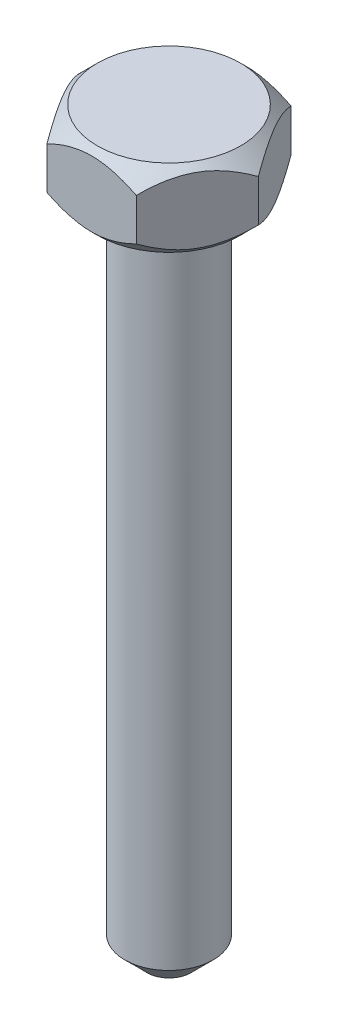
ISO-10303-21;
HEADER;
FILE_DESCRIPTION(('STEP AP214'),'2;1');
FILE_NAME('part.step','',(''),(''),'','','');
FILE_SCHEMA(('AUTOMOTIVE_DESIGN { 1 0 10303 214 1 1 1 1 }'));
ENDSEC;
DATA;
#1=APPLICATION_CONTEXT('core data for automotive mechanical design processes');
#2=APPLICATION_PROTOCOL_DEFINITION('international standard','automotive_design',2000,#1);
#3=PRODUCT_CONTEXT('',#1,'mechanical');
#4=PRODUCT('Part','Part','',(#3));
#5=PRODUCT_RELATED_PRODUCT_CATEGORY('part','',(#4));
#6=PRODUCT_DEFINITION_FORMATION('','',#4);
#7=PRODUCT_DEFINITION_CONTEXT('part definition',#1,'design');
#8=PRODUCT_DEFINITION('design','',#6,#7);
#9=PRODUCT_DEFINITION_SHAPE('','',#8);
#10=(LENGTH_UNIT() NAMED_UNIT(*) SI_UNIT(.MILLI.,.METRE.));
#11=(NAMED_UNIT(*) PLANE_ANGLE_UNIT() SI_UNIT($,.RADIAN.));
#12=(NAMED_UNIT(*) SI_UNIT($,.STERADIAN.) SOLID_ANGLE_UNIT());
#13=UNCERTAINTY_MEASURE_WITH_UNIT(LENGTH_MEASURE(1.E-05),#10,'distance_accuracy_value','');
#14=(GEOMETRIC_REPRESENTATION_CONTEXT(3) GLOBAL_UNCERTAINTY_ASSIGNED_CONTEXT((#13)) GLOBAL_UNIT_ASSIGNED_CONTEXT((#10,
#11,#12)) REPRESENTATION_CONTEXT('',''));
#15=CARTESIAN_POINT('',(0.,0.,0.));
#16=DIRECTION('',(0.,0.,1.));
#17=DIRECTION('',(1.,0.,0.));
#18=AXIS2_PLACEMENT_3D('',#15,#16,#17);
#19=CARTESIAN_POINT('',(-4.04145188432739,-3.5,0.));
#20=DIRECTION('',(0.,1.,0.));
#21=DIRECTION('',(0.,0.,1.));
#22=AXIS2_PLACEMENT_3D('',#19,#20,#21);
#23=PLANE('',#22);
#24=CARTESIAN_POINT('',(0.,-3.5,0.));
#25=DIRECTION('',(0.,1.,0.));
#26=DIRECTION('',(0.,0.,1.));
#27=AXIS2_PLACEMENT_3D('',#24,#25,#26);
#28=CIRCLE('',#27,3.24145188432739);
#29=CARTESIAN_POINT('',(0.,-3.5,3.24145188432739));
#30=VERTEX_POINT('',#29);
#31=EDGE_CURVE('E101',#30,#30,#28,.T.);
#32=ORIENTED_EDGE('',*,*,#31,.F.);
#33=EDGE_LOOP('',(#32));
#34=FACE_BOUND('',#33,.T.);
#35=CARTESIAN_POINT('',(0.,-3.5,0.));
#36=DIRECTION('',(0.,1.,0.));
#37=DIRECTION('',(0.,0.,1.));
#38=AXIS2_PLACEMENT_3D('',#35,#36,#37);
#39=CIRCLE('',#38,2.);
#40=CARTESIAN_POINT('',(0.,-3.5,2.));
#41=VERTEX_POINT('',#40);
#42=EDGE_CURVE('E116',#41,#41,#39,.F.);
#43=ORIENTED_EDGE('',*,*,#42,.F.);
#44=EDGE_LOOP('',(#43));
#45=FACE_BOUND('',#44,.T.);
#46=ADVANCED_FACE('F28',(#34,#45),#23,.F.);
#47=CARTESIAN_POINT('',(0.,-33.5,0.));
#48=DIRECTION('',(0.,1.,0.));
#49=DIRECTION('',(0.,0.,1.));
#50=AXIS2_PLACEMENT_3D('',#47,#48,#49);
#51=CYLINDRICAL_SURFACE('',#50,2.);
#52=CARTESIAN_POINT('',(0.,-32.5,0.));
#53=DIRECTION('',(0.,-1.,0.));
#54=DIRECTION('',(0.,0.,-1.));
#55=AXIS2_PLACEMENT_3D('',#52,#53,#54);
#56=CIRCLE('',#55,2.);
#57=CARTESIAN_POINT('',(0.,-32.5,-2.));
#58=VERTEX_POINT('',#57);
#59=EDGE_CURVE('E41',#58,#58,#56,.F.);
#60=ORIENTED_EDGE('',*,*,#59,.T.);
#61=EDGE_LOOP('',(#60));
#62=FACE_BOUND('',#61,.T.);
#63=ORIENTED_EDGE('',*,*,#42,.T.);
#64=EDGE_LOOP('',(#63));
#65=FACE_BOUND('',#64,.T.);
#66=ADVANCED_FACE('F125',(#62,#65),#51,.T.);
#67=CARTESIAN_POINT('',(0.,-33.5,0.));
#68=DIRECTION('',(0.,-1.,0.));
#69=DIRECTION('',(0.,0.,-1.));
#70=AXIS2_PLACEMENT_3D('',#67,#68,#69);
#71=PLANE('',#70);
#72=CARTESIAN_POINT('',(0.,-33.5,0.));
#73=DIRECTION('',(0.,-1.,0.));
#74=DIRECTION('',(0.,0.,-1.));
#75=AXIS2_PLACEMENT_3D('',#72,#73,#74);
#76=CIRCLE('',#75,0.999999999999997);
#77=CARTESIAN_POINT('',(0.,-33.5,-0.999999999999997));
#78=VERTEX_POINT('',#77);
#79=EDGE_CURVE('E119',#78,#78,#76,.T.);
#80=ORIENTED_EDGE('',*,*,#79,.T.);
#81=EDGE_LOOP('',(#80));
#82=FACE_BOUND('',#81,.T.);
#83=ADVANCED_FACE('F131',(#82),#71,.T.);
#84=CARTESIAN_POINT('',(0.,-33.5,0.));
#85=DIRECTION('',(0.,1.,0.));
#86=DIRECTION('',(0.,0.,1.));
#87=AXIS2_PLACEMENT_3D('',#84,#85,#86);
#88=CONICAL_SURFACE('',#87,0.999999999999997,0.785398163397446);
#89=ORIENTED_EDGE('',*,*,#59,.F.);
#90=EDGE_LOOP('',(#89));
#91=FACE_BOUND('',#90,.T.);
#92=ORIENTED_EDGE('',*,*,#79,.F.);
#93=EDGE_LOOP('',(#92));
#94=FACE_BOUND('',#93,.T.);
#95=ADVANCED_FACE('F128',(#91,#94),#88,.T.);
#96=CARTESIAN_POINT('',(0.,-3.5,0.));
#97=DIRECTION('',(0.,1.,0.));
#98=DIRECTION('',(0.,0.,1.));
#99=AXIS2_PLACEMENT_3D('',#96,#97,#98);
#100=CONICAL_SURFACE('',#99,3.24145188432739,0.785398163397448);
#101=CARTESIAN_POINT('',(-4.04156735438123,-2.69988452499759,0.000200000000024374));
#102=CARTESIAN_POINT('',(-3.97210706066971,-2.76928406626867,-0.120108757816985));
#103=CARTESIAN_POINT('',(-3.90148531215406,-2.83460752114448,-0.242429214365436));
#104=CARTESIAN_POINT('',(-3.75747991147154,-2.95421294831347,-0.491853884911885));
#105=CARTESIAN_POINT('',(-3.68408256574986,-3.00842837712061,-0.618981816842531));
#106=CARTESIAN_POINT('',(-3.53608035685404,-3.10130032476617,-0.875329162282505));
#107=CARTESIAN_POINT('',(-3.4615131811703,-3.14019025979249,-1.00448329914366));
#108=CARTESIAN_POINT('',(-3.310737295381,-3.20010809560693,-1.26563479388693));
#109=CARTESIAN_POINT('',(-3.2345331906662,-3.22118071965238,-1.39762417499826));
#110=CARTESIAN_POINT('',(-3.10319782183118,-3.24019388535166,-1.62510370665133));
#111=CARTESIAN_POINT('',(-3.04823615399914,-3.24300830014006,-1.72030010780514));
#112=CARTESIAN_POINT('',(-2.93840222621348,-3.23826531256006,-1.91053805112477));
#113=CARTESIAN_POINT('',(-2.88353000435282,-3.23070427424299,-2.00557952731161));
#114=CARTESIAN_POINT('',(-2.77430542200353,-3.20564210374561,-2.19476205337608));
#115=CARTESIAN_POINT('',(-2.71995371223669,-3.1881298536199,-2.28890197617048));
#116=CARTESIAN_POINT('',(-2.61218376551828,-3.14412110260569,-2.47556499941575));
#117=CARTESIAN_POINT('',(-2.55876545732786,-3.11762529053566,-2.56808822325595));
#118=CARTESIAN_POINT('',(-2.46393368006796,-3.06311203056568,-2.73234167964214));
#119=CARTESIAN_POINT('',(-2.42231028209656,-3.03652769615024,-2.80443551971227));
#120=CARTESIAN_POINT('',(-2.33981072759412,-2.97907462503668,-2.94732893971228));
#121=CARTESIAN_POINT('',(-2.29893459386685,-2.94820575783654,-3.01812848014491));
#122=CARTESIAN_POINT('',(-2.21805834837752,-2.88287565935588,-3.15821024645784));
#123=CARTESIAN_POINT('',(-2.17805593632086,-2.84842572434904,-3.22749645656527));
#124=CARTESIAN_POINT('',(-2.09879193666162,-2.77638590028467,-3.36478573118621));
#125=CARTESIAN_POINT('',(-2.05952991236256,-2.73879793793946,-3.43278955208019));
#126=CARTESIAN_POINT('',(-2.02061047210986,-2.69988452499759,-3.5002));
#127=B_SPLINE_CURVE_WITH_KNOTS('',3,(#101,#102,#103,#104,#105,#106,#107,#108,#109,#110,#111,
#112,#113,#114,#115,#116,#117,#118,#119,#120,#121,#122,#123,#124,#125,#126),.UNSPECIFIED.,.F.,
.F.,(4,2,2,2,2,2,2,2,2,2,2,2,4),(0.,0.466195029511836,0.935106055247671,1.39657035229711,
1.85687285909026,2.18628459516077,2.51581179896772,2.84570789142401,3.17557869467338,
3.4376213889119,3.69967206642682,3.96091985737579,4.22200840855898),.UNSPECIFIED.);
#128=CARTESIAN_POINT('',(-4.04145188432739,-2.7,0.));
#129=VERTEX_POINT('',#128);
#130=CARTESIAN_POINT('',(-2.02072594216371,-2.7,-3.5));
#131=VERTEX_POINT('',#130);
#132=EDGE_CURVE('E176',#129,#131,#127,.T.);
#133=ORIENTED_EDGE('',*,*,#132,.T.);
#134=CARTESIAN_POINT('',(-4.11343909523356,-1.34049074854832,-3.5));
#135=CARTESIAN_POINT('',(-4.01364790461446,-1.41647576800568,-3.5));
#136=CARTESIAN_POINT('',(-3.91330741187747,-1.4917509457735,-3.5));
#137=CARTESIAN_POINT('',(-3.71130759190236,-1.64056086288985,-3.5));
#138=CARTESIAN_POINT('',(-3.60964794828074,-1.71409517230361,-3.5));
#139=CARTESIAN_POINT('',(-3.40404593483019,-1.85962589901091,-3.5));
#140=CARTESIAN_POINT('',(-3.30009198936034,-1.93160601709034,-3.5));
#141=CARTESIAN_POINT('',(-3.09043455319368,-2.07296300910746,-3.5));
#142=CARTESIAN_POINT('',(-2.98473118535169,-2.14234006473914,-3.5));
#143=CARTESIAN_POINT('',(-2.76489352426084,-2.28196781927053,-3.5));
#144=CARTESIAN_POINT('',(-2.65063360057755,-2.35202171786016,-3.5));
#145=CARTESIAN_POINT('',(-2.41943843809483,-2.48764015461377,-3.5));
#146=CARTESIAN_POINT('',(-2.30250276768208,-2.55320396159193,-3.5));
#147=CARTESIAN_POINT('',(-2.06594770908092,-2.6784356928961,-3.5));
#148=CARTESIAN_POINT('',(-1.94633756764447,-2.73812094705998,-3.5));
#149=CARTESIAN_POINT('',(-1.70380065325271,-2.85025883184051,-3.5));
#150=CARTESIAN_POINT('',(-1.58087544221088,-2.90271479977525,-3.5));
#151=CARTESIAN_POINT('',(-1.34256664054354,-2.99425414604565,-3.5));
#152=CARTESIAN_POINT('',(-1.22748347184254,-3.03411159832747,-3.5));
#153=CARTESIAN_POINT('',(-0.994473602956439,-3.10460445258339,-3.5));
#154=CARTESIAN_POINT('',(-0.876546714407832,-3.13523924184055,-3.5));
#155=CARTESIAN_POINT('',(-0.640555797612561,-3.18515136149643,-3.5));
#156=CARTESIAN_POINT('',(-0.522534731770002,-3.20462846737207,-3.5));
#157=CARTESIAN_POINT('',(-0.285138833258746,-3.23183388871137,-3.5));
#158=CARTESIAN_POINT('',(-0.165764258218942,-3.23956440343576,-3.5));
#159=CARTESIAN_POINT('',(0.0684345425591306,-3.24266430583436,-3.5));
#160=CARTESIAN_POINT('',(0.183252604656246,-3.23850904804464,-3.5));
#161=CARTESIAN_POINT('',(0.41194538139855,-3.21913596089254,-3.5));
#162=CARTESIAN_POINT('',(0.525820005903612,-3.20391708651605,-3.5));
#163=CARTESIAN_POINT('',(0.753728692005361,-3.16300182207144,-3.5));
#164=CARTESIAN_POINT('',(0.867729673651151,-3.13712416826838,-3.5));
#165=CARTESIAN_POINT('',(1.09323660944141,-3.07629621041035,-3.5));
#166=CARTESIAN_POINT('',(1.20474274230377,-3.04134655850057,-3.5));
#167=CARTESIAN_POINT('',(1.43351745819777,-2.96089193875029,-3.5));
#168=CARTESIAN_POINT('',(1.55057121674902,-2.91478260530312,-3.5));
#169=CARTESIAN_POINT('',(1.78163768388521,-2.81546896217881,-3.5));
#170=CARTESIAN_POINT('',(1.8956493792125,-2.76226232305919,-3.5));
#171=CARTESIAN_POINT('',(2.12120309504484,-2.65000927106598,-3.5));
#172=CARTESIAN_POINT('',(2.23273581617762,-2.59094432351664,-3.5));
#173=CARTESIAN_POINT('',(2.45323999840432,-2.46828035973536,-3.5));
#174=CARTESIAN_POINT('',(2.56221185705048,-2.40468205353482,-3.5));
#175=CARTESIAN_POINT('',(2.77258648527557,-2.27708230144591,-3.5));
#176=CARTESIAN_POINT('',(2.87409670716152,-2.21325707762329,-3.5));
#177=CARTESIAN_POINT('',(3.07537374659972,-2.08290631812229,-3.5));
#178=CARTESIAN_POINT('',(3.17514043189724,-2.01638057885912,-3.5));
#179=CARTESIAN_POINT('',(3.37235277259435,-1.88165662424084,-3.5));
#180=CARTESIAN_POINT('',(3.46981066719971,-1.81347626064957,-3.5));
#181=CARTESIAN_POINT('',(3.66339199507936,-1.67530022312019,-3.5));
#182=CARTESIAN_POINT('',(3.75951578844138,-1.60530505424452,-3.5));
#183=CARTESIAN_POINT('',(3.85508044256854,-1.53456747820942,-3.5));
#184=B_SPLINE_CURVE_WITH_KNOTS('',3,(#134,#135,#136,#137,#138,#139,#140,#141,#142,#143,#144,
#145,#146,#147,#148,#149,#150,#151,#152,#153,#154,#155,#156,#157,#158,#159,#160,#161,#162,#163,
#164,#165,#166,#167,#168,#169,#170,#171,#172,#173,#174,#175,#176,#177,#178,#179,#180,#181,#182,
#183),.UNSPECIFIED.,.F.,.F.,(4,2,2,2,2,2,2,2,2,2,2,2,2,2,2,2,2,2,2,2,2,2,2,2,4),(0.,
0.376289066832934,0.752670114666427,1.13196303882771,1.51122943887124,1.91322439656266,
2.31528466194431,2.71612176675466,3.11677320534959,3.48182442073459,3.84689988331699,
4.20521619183289,4.56346540614943,4.90758964289977,5.25174638813573,5.60201478075691,
5.95225800112648,6.32939036689254,6.70664681914763,7.08513741857289,7.46356886710629,
7.82324340751906,8.18294511339456,8.53974109313966,8.89643881996947),.UNSPECIFIED.);
#185=CARTESIAN_POINT('',(2.02072594216368,-2.7,-3.50000000000001));
#186=VERTEX_POINT('',#185);
#187=EDGE_CURVE('E170',#131,#186,#184,.T.);
#188=ORIENTED_EDGE('',*,*,#187,.T.);
#189=CARTESIAN_POINT('',(2.02061047210985,-2.69988452499759,-3.5002));
#190=CARTESIAN_POINT('',(2.09007076582137,-2.76928406626868,-3.37989124218299));
#191=CARTESIAN_POINT('',(2.16069251433702,-2.83460752114448,-3.25757078563454));
#192=CARTESIAN_POINT('',(2.30469791501954,-2.95421294831348,-3.00814611508809));
#193=CARTESIAN_POINT('',(2.37809526074122,-3.00842837712062,-2.88101818315745));
#194=CARTESIAN_POINT('',(2.52609746963704,-3.10130032476617,-2.62467083771748));
#195=CARTESIAN_POINT('',(2.60066464532078,-3.14019025979249,-2.49551670085632));
#196=CARTESIAN_POINT('',(2.75144053111008,-3.20010809560693,-2.23436520611305));
#197=CARTESIAN_POINT('',(2.82764463582487,-3.22118071965239,-2.10237582500172));
#198=CARTESIAN_POINT('',(2.9589800046599,-3.24019388535166,-1.87489629334866));
#199=CARTESIAN_POINT('',(3.01394167249194,-3.24300830014006,-1.77969989219485));
#200=CARTESIAN_POINT('',(3.1237756002776,-3.23826531256006,-1.58946194887522));
#201=CARTESIAN_POINT('',(3.17864782213825,-3.230704274243,-1.49442047268838));
#202=CARTESIAN_POINT('',(3.28787240448755,-3.20564210374561,-1.30523794662391));
#203=CARTESIAN_POINT('',(3.34222411425439,-3.1881298536199,-1.21109802382951));
#204=CARTESIAN_POINT('',(3.4499940609728,-3.14412110260569,-1.02443500058424));
#205=CARTESIAN_POINT('',(3.50341236916322,-3.11762529053567,-0.931911776744044));
#206=CARTESIAN_POINT('',(3.59824414642312,-3.06311203056568,-0.767658320357851));
#207=CARTESIAN_POINT('',(3.63986754439452,-3.03652769615024,-0.695564480287725));
#208=CARTESIAN_POINT('',(3.72236709889696,-2.97907462503668,-0.552671060287705));
#209=CARTESIAN_POINT('',(3.76324323262423,-2.94820575783654,-0.481871519855081));
#210=CARTESIAN_POINT('',(3.84411947811356,-2.88287565935588,-0.34178975354215));
#211=CARTESIAN_POINT('',(3.88412189017022,-2.84842572434904,-0.272503543434718));
#212=CARTESIAN_POINT('',(3.96338588982947,-2.77638590028467,-0.135214268813778));
#213=CARTESIAN_POINT('',(4.00264791412853,-2.73879793793945,-0.0672104479197992));
#214=CARTESIAN_POINT('',(4.04156735438122,-2.69988452499759,0.0002000000000135));
#215=B_SPLINE_CURVE_WITH_KNOTS('',3,(#189,#190,#191,#192,#193,#194,#195,#196,#197,#198,#199,
#200,#201,#202,#203,#204,#205,#206,#207,#208,#209,#210,#211,#212,#213,#214),.UNSPECIFIED.,.F.,
.F.,(4,2,2,2,2,2,2,2,2,2,2,2,4),(0.,0.466195029511833,0.935106055247665,1.3965703522971,
1.85687285909024,2.18628459516076,2.51581179896771,2.84570789142399,3.17557869467336,
3.43762138891188,3.69967206642681,3.96091985737578,4.22200840855897),.UNSPECIFIED.);
#216=CARTESIAN_POINT('',(4.04145188432739,-2.7,0.));
#217=VERTEX_POINT('',#216);
#218=EDGE_CURVE('E89',#186,#217,#215,.T.);
#219=ORIENTED_EDGE('',*,*,#218,.T.);
#220=CARTESIAN_POINT('',(4.04156735438122,-2.69988452499759,-0.000199999999987047));
#221=CARTESIAN_POINT('',(3.9721070606697,-2.76928406626868,0.120108757817022));
#222=CARTESIAN_POINT('',(3.90148531215406,-2.83460752114448,0.242429214365472));
#223=CARTESIAN_POINT('',(3.75747991147153,-2.95421294831348,0.491853884911919));
#224=CARTESIAN_POINT('',(3.68408256574985,-3.00842837712061,0.618981816842565));
#225=CARTESIAN_POINT('',(3.53608035685403,-3.10130032476617,0.875329162282538));
#226=CARTESIAN_POINT('',(3.46151318117029,-3.14019025979249,1.00448329914369));
#227=CARTESIAN_POINT('',(3.31073729538099,-3.20010809560693,1.26563479388696));
#228=CARTESIAN_POINT('',(3.23453319066619,-3.22118071965238,1.39762417499829));
#229=CARTESIAN_POINT('',(3.10319782183116,-3.24019388535166,1.62510370665136));
#230=CARTESIAN_POINT('',(3.04823615399913,-3.24300830014006,1.72030010780516));
#231=CARTESIAN_POINT('',(2.93840222621346,-3.23826531256006,1.91053805112479));
#232=CARTESIAN_POINT('',(2.88353000435281,-3.230704274243,2.00557952731163));
#233=CARTESIAN_POINT('',(2.77430542200351,-3.20564210374561,2.19476205337611));
#234=CARTESIAN_POINT('',(2.71995371223667,-3.1881298536199,2.2889019761705));
#235=CARTESIAN_POINT('',(2.61218376551826,-3.14412110260569,2.47556499941577));
#236=CARTESIAN_POINT('',(2.55876545732783,-3.11762529053566,2.56808822325597));
#237=CARTESIAN_POINT('',(2.46393368006794,-3.06311203056568,2.73234167964216));
#238=CARTESIAN_POINT('',(2.42231028209654,-3.03652769615024,2.80443551971228));
#239=CARTESIAN_POINT('',(2.3398107275941,-2.97907462503668,2.9473289397123));
#240=CARTESIAN_POINT('',(2.29893459386683,-2.94820575783654,3.01812848014492));
#241=CARTESIAN_POINT('',(2.2180583483775,-2.88287565935588,3.15821024645785));
#242=CARTESIAN_POINT('',(2.17805593632084,-2.84842572434904,3.22749645656528));
#243=CARTESIAN_POINT('',(2.0987919366616,-2.77638590028468,3.36478573118621));
#244=CARTESIAN_POINT('',(2.05952991236254,-2.73879793793947,3.43278955208019));
#245=CARTESIAN_POINT('',(2.02061047210984,-2.6998845249976,3.5002));
#246=B_SPLINE_CURVE_WITH_KNOTS('',3,(#220,#221,#222,#223,#224,#225,#226,#227,#228,#229,#230,
#231,#232,#233,#234,#235,#236,#237,#238,#239,#240,#241,#242,#243,#244,#245),.UNSPECIFIED.,.F.,
.F.,(4,2,2,2,2,2,2,2,2,2,2,2,4),(0.,0.466195029511836,0.93510605524767,1.39657035229711,
1.85687285909025,2.18628459516077,2.51581179896772,2.845707891424,3.17557869467337,
3.43762138891189,3.69967206642681,3.96091985737577,4.22200840855895),.UNSPECIFIED.);
#247=CARTESIAN_POINT('',(2.02072594216371,-2.7,3.5));
#248=VERTEX_POINT('',#247);
#249=EDGE_CURVE('E85',#217,#248,#246,.T.);
#250=ORIENTED_EDGE('',*,*,#249,.T.);
#251=CARTESIAN_POINT('',(-4.11343909532792,-1.34049074847645,3.5));
#252=CARTESIAN_POINT('',(-4.01364790470614,-1.41647576793658,3.5));
#253=CARTESIAN_POINT('',(-3.91330741196645,-1.49175094570717,3.5));
#254=CARTESIAN_POINT('',(-3.71130759198594,-1.64056086282906,3.5));
#255=CARTESIAN_POINT('',(-3.6096479483616,-1.71409517224557,3.5));
#256=CARTESIAN_POINT('',(-3.40404593490552,-1.8596258989584,3.5));
#257=CARTESIAN_POINT('',(-3.30009198943286,-1.9316060170406,3.5));
#258=CARTESIAN_POINT('',(-3.09043455326054,-2.07296300906322,3.5));
#259=CARTESIAN_POINT('',(-2.98473118541569,-2.14234006469764,3.5));
#260=CARTESIAN_POINT('',(-2.76489352431867,-2.28196781923471,3.5));
#261=CARTESIAN_POINT('',(-2.65063360063206,-2.35202171782728,3.5));
#262=CARTESIAN_POINT('',(-2.41943843814258,-2.48764015458666,3.5));
#263=CARTESIAN_POINT('',(-2.3025027677264,-2.55320396156762,3.5));
#264=CARTESIAN_POINT('',(-2.06594770911824,-2.67843569287718,3.5));
#265=CARTESIAN_POINT('',(-1.94633756767823,-2.73812094704364,3.5));
#266=CARTESIAN_POINT('',(-1.70380065327916,-2.85025883182901,3.5));
#267=CARTESIAN_POINT('',(-1.58087544223358,-2.902714799766,3.5));
#268=CARTESIAN_POINT('',(-1.34256664056464,-2.99425414603802,3.5));
#269=CARTESIAN_POINT('',(-1.22748347186597,-3.03411159831963,3.5));
#270=CARTESIAN_POINT('',(-0.994473602984598,-3.10460445257561,3.5));
#271=CARTESIAN_POINT('',(-0.876546714438396,-3.13523924183304,3.5));
#272=CARTESIAN_POINT('',(-0.640555797647857,-3.18515136148999,3.5));
#273=CARTESIAN_POINT('',(-0.522534731807625,-3.20462846736643,3.5));
#274=CARTESIAN_POINT('',(-0.285138833300951,-3.23183388870786,3.5));
#275=CARTESIAN_POINT('',(-0.165764258263403,-3.23956440343358,3.5));
#276=CARTESIAN_POINT('',(0.0684345425106541,-3.24266430583524,3.5));
#277=CARTESIAN_POINT('',(0.183252604606004,-3.23850904804722,3.5));
#278=CARTESIAN_POINT('',(0.411945381344963,-3.21913596089876,3.5));
#279=CARTESIAN_POINT('',(0.525820005848445,-3.20391708652421,3.5));
#280=CARTESIAN_POINT('',(0.753728691947076,-3.16300182208367,3.5));
#281=CARTESIAN_POINT('',(0.867729673591332,-3.13712416828275,3.5));
#282=CARTESIAN_POINT('',(1.09323660937868,-3.07629621042903,3.5));
#283=CARTESIAN_POINT('',(1.20474274223966,-3.04134655852143,3.5));
#284=CARTESIAN_POINT('',(1.4335174581261,-2.96089193877731,3.5));
#285=CARTESIAN_POINT('',(1.5505712166713,-2.9147826053345,3.5));
#286=CARTESIAN_POINT('',(1.78163768379569,-2.81546896221932,3.5));
#287=CARTESIAN_POINT('',(1.89564937911723,-2.76226232310448,3.5));
#288=CARTESIAN_POINT('',(2.12120309493829,-2.65000927112113,3.5));
#289=CARTESIAN_POINT('',(2.23273581606554,-2.59094432357686,3.5));
#290=CARTESIAN_POINT('',(2.45323999828135,-2.46828035980589,3.5));
#291=CARTESIAN_POINT('',(2.56221185692215,-2.40468205361059,3.5));
#292=CARTESIAN_POINT('',(2.77258648513752,-2.27708230153161,3.5));
#293=CARTESIAN_POINT('',(2.87409670701908,-2.21325707771367,3.5));
#294=CARTESIAN_POINT('',(3.07537374644856,-2.08290631822205,3.5));
#295=CARTESIAN_POINT('',(3.17514043174175,-2.01638057896358,3.5));
#296=CARTESIAN_POINT('',(3.37235277243031,-1.88165662435465,3.5));
#297=CARTESIAN_POINT('',(3.46981066703145,-1.81347626076803,3.5));
#298=CARTESIAN_POINT('',(3.66339199490269,-1.67530022324793,3.5));
#299=CARTESIAN_POINT('',(3.75951578826051,-1.60530505437691,3.5));
#300=CARTESIAN_POINT('',(3.85508044238348,-1.53456747834644,3.5));
#301=B_SPLINE_CURVE_WITH_KNOTS('',3,(#251,#252,#253,#254,#255,#256,#257,#258,#259,#260,#261,
#262,#263,#264,#265,#266,#267,#268,#269,#270,#271,#272,#273,#274,#275,#276,#277,#278,#279,#280,
#281,#282,#283,#284,#285,#286,#287,#288,#289,#290,#291,#292,#293,#294,#295,#296,#297,#298,#299,
#300),.UNSPECIFIED.,.F.,.F.,(4,2,2,2,2,2,2,2,2,2,2,2,2,2,2,2,2,2,2,2,2,2,2,2,4),(0.,
0.376289066844382,0.752670114689327,1.13196303886228,1.51122943891747,1.91322439662199,
2.31528466201676,2.7161217668401,3.11677320544801,3.48182442082625,3.84689988340191,
4.20521619191135,4.56346540622143,4.90758964296631,5.25174638819682,5.60201478081209,
5.95225800117576,6.32939036692017,6.70664681915359,7.08513741855706,7.46356886706867,
7.82324340746283,8.1829451133197,8.53974109304643,8.89643881985787),.UNSPECIFIED.);
#302=CARTESIAN_POINT('',(-2.02072594216367,-2.70000000000002,3.5));
#303=VERTEX_POINT('',#302);
#304=EDGE_CURVE('E47',#248,#303,#301,.F.);
#305=ORIENTED_EDGE('',*,*,#304,.T.);
#306=CARTESIAN_POINT('',(-2.02061047210983,-2.69988452499761,3.5002));
#307=CARTESIAN_POINT('',(-2.09007076582135,-2.76928406626869,3.37989124218299));
#308=CARTESIAN_POINT('',(-2.160692514337,-2.83460752114449,3.25757078563455));
#309=CARTESIAN_POINT('',(-2.30469791501952,-2.95421294831349,3.0081461150881));
#310=CARTESIAN_POINT('',(-2.3780952607412,-3.00842837712062,2.88101818315746));
#311=CARTESIAN_POINT('',(-2.52609746963702,-3.10130032476618,2.62467083771749));
#312=CARTESIAN_POINT('',(-2.60066464532076,-3.14019025979249,2.49551670085634));
#313=CARTESIAN_POINT('',(-2.75144053111006,-3.20010809560693,2.23436520611307));
#314=CARTESIAN_POINT('',(-2.82764463582486,-3.22118071965239,2.10237582500175));
#315=CARTESIAN_POINT('',(-2.95898000465988,-3.24019388535166,1.87489629334868));
#316=CARTESIAN_POINT('',(-3.01394167249192,-3.24300830014006,1.77969989219488));
#317=CARTESIAN_POINT('',(-3.12377560027759,-3.23826531256006,1.58946194887525));
#318=CARTESIAN_POINT('',(-3.17864782213824,-3.23070427424299,1.49442047268841));
#319=CARTESIAN_POINT('',(-3.28787240448754,-3.20564210374561,1.30523794662394));
#320=CARTESIAN_POINT('',(-3.34222411425438,-3.1881298536199,1.21109802382954));
#321=CARTESIAN_POINT('',(-3.44999406097279,-3.14412110260569,1.02443500058427));
#322=CARTESIAN_POINT('',(-3.50341236916322,-3.11762529053566,0.931911776744076));
#323=CARTESIAN_POINT('',(-3.59824414642311,-3.06311203056568,0.767658320357883));
#324=CARTESIAN_POINT('',(-3.63986754439451,-3.03652769615024,0.695564480287757));
#325=CARTESIAN_POINT('',(-3.72236709889695,-2.97907462503668,0.552671060287739));
#326=CARTESIAN_POINT('',(-3.76324323262423,-2.94820575783654,0.481871519855115));
#327=CARTESIAN_POINT('',(-3.84411947811356,-2.88287565935587,0.341789753542185));
#328=CARTESIAN_POINT('',(-3.88412189017022,-2.84842572434903,0.272503543434753));
#329=CARTESIAN_POINT('',(-3.96338588982947,-2.77638590028466,0.135214268813814));
#330=CARTESIAN_POINT('',(-4.00264791412853,-2.73879793793945,0.0672104479198364));
#331=CARTESIAN_POINT('',(-4.04156735438123,-2.69988452499759,-0.000199999999975865));
#332=B_SPLINE_CURVE_WITH_KNOTS('',3,(#306,#307,#308,#309,#310,#311,#312,#313,#314,#315,#316,
#317,#318,#319,#320,#321,#322,#323,#324,#325,#326,#327,#328,#329,#330,#331),.UNSPECIFIED.,.F.,
.F.,(4,2,2,2,2,2,2,2,2,2,2,2,4),(0.,0.466195029511828,0.935106055247654,1.39657035229708,
1.85687285909022,2.18628459516074,2.51581179896768,2.84570789142397,3.17557869467334,
3.43762138891186,3.69967206642679,3.96091985737576,4.22200840855895),.UNSPECIFIED.);
#333=EDGE_CURVE('E11',#303,#129,#332,.T.);
#334=ORIENTED_EDGE('',*,*,#333,.T.);
#335=EDGE_LOOP('',(#133,#188,#219,#250,#305,#334));
#336=FACE_BOUND('',#335,.T.);
#337=ORIENTED_EDGE('',*,*,#31,.T.);
#338=EDGE_LOOP('',(#337));
#339=FACE_BOUND('',#338,.T.);
#340=ADVANCED_FACE('F86',(#336,#339),#100,.T.);
#341=CARTESIAN_POINT('',(-4.04145188432739,0.,0.));
#342=DIRECTION('',(0.,1.,0.));
#343=DIRECTION('',(0.,0.,1.));
#344=AXIS2_PLACEMENT_3D('',#341,#342,#343);
#345=PLANE('',#344);
#346=CARTESIAN_POINT('',(0.,0.,0.));
#347=DIRECTION('',(0.,1.,0.));
#348=DIRECTION('',(0.,0.,1.));
#349=AXIS2_PLACEMENT_3D('',#346,#347,#348);
#350=CIRCLE('',#349,3.24145188432739);
#351=CARTESIAN_POINT('',(0.,0.,3.24145188432739));
#352=VERTEX_POINT('',#351);
#353=EDGE_CURVE('E233',#352,#352,#350,.T.);
#354=ORIENTED_EDGE('',*,*,#353,.T.);
#355=EDGE_LOOP('',(#354));
#356=FACE_BOUND('',#355,.T.);
#357=ADVANCED_FACE('F151',(#356),#345,.T.);
#358=CARTESIAN_POINT('',(0.,-0.8,0.));
#359=DIRECTION('',(0.,-1.,0.));
#360=DIRECTION('',(0.,0.,-1.));
#361=AXIS2_PLACEMENT_3D('',#358,#359,#360);
#362=CONICAL_SURFACE('',#361,4.04145188432739,0.785398163397448);
#363=CARTESIAN_POINT('',(-2.02061047210986,-0.800115475002408,-3.5002));
#364=CARTESIAN_POINT('',(-2.09007076582138,-0.730715933731321,-3.37989124218299));
#365=CARTESIAN_POINT('',(-2.16069251433702,-0.665392478855521,-3.25757078563454));
#366=CARTESIAN_POINT('',(-2.30469791501955,-0.545787051686524,-3.00814611508809));
#367=CARTESIAN_POINT('',(-2.37809526074123,-0.491571622879386,-2.88101818315745));
#368=CARTESIAN_POINT('',(-2.52609746963704,-0.398699675233827,-2.62467083771747));
#369=CARTESIAN_POINT('',(-2.60066464532078,-0.359809740207512,-2.49551670085632));
#370=CARTESIAN_POINT('',(-2.75144053111008,-0.299891904393072,-2.23436520611305));
#371=CARTESIAN_POINT('',(-2.82764463582488,-0.278819280347616,-2.10237582500172));
#372=CARTESIAN_POINT('',(-2.95898000465991,-0.259806114648342,-1.87489629334865));
#373=CARTESIAN_POINT('',(-3.01394167249194,-0.256991699859938,-1.77969989219485));
#374=CARTESIAN_POINT('',(-3.12377560027761,-0.261734687439937,-1.58946194887522));
#375=CARTESIAN_POINT('',(-3.17864782213826,-0.269295725757006,-1.49442047268838));
#376=CARTESIAN_POINT('',(-3.28787240448756,-0.294357896254393,-1.3052379466239));
#377=CARTESIAN_POINT('',(-3.34222411425439,-0.311870146380099,-1.2110980238295));
#378=CARTESIAN_POINT('',(-3.4499940609728,-0.355878897394313,-1.02443500058423));
#379=CARTESIAN_POINT('',(-3.50341236916323,-0.382374709464336,-0.931911776744037));
#380=CARTESIAN_POINT('',(-3.59824414642312,-0.436887969434318,-0.767658320357844));
#381=CARTESIAN_POINT('',(-3.63986754439452,-0.463472303849764,-0.695564480287717));
#382=CARTESIAN_POINT('',(-3.72236709889696,-0.520925374963324,-0.552671060287697));
#383=CARTESIAN_POINT('',(-3.76324323262424,-0.551794242163462,-0.481871519855072));
#384=CARTESIAN_POINT('',(-3.84411947811357,-0.617124340644127,-0.34178975354214));
#385=CARTESIAN_POINT('',(-3.88412189017022,-0.651574275650966,-0.272503543434707));
#386=CARTESIAN_POINT('',(-3.96338588982947,-0.723614099715335,-0.135214268813767));
#387=CARTESIAN_POINT('',(-4.00264791412853,-0.761202062060548,-0.0672104479197882));
#388=CARTESIAN_POINT('',(-4.04156735438123,-0.800115475002413,0.000200000000024801));
#389=B_SPLINE_CURVE_WITH_KNOTS('',3,(#363,#364,#365,#366,#367,#368,#369,#370,#371,#372,#373,
#374,#375,#376,#377,#378,#379,#380,#381,#382,#383,#384,#385,#386,#387,#388),.UNSPECIFIED.,.F.,
.F.,(4,2,2,2,2,2,2,2,2,2,2,2,4),(0.,0.466195029511835,0.935106055247666,1.3965703522971,
1.85687285909025,2.18628459516076,2.51581179896771,2.84570789142399,3.17557869467337,
3.43762138891189,3.69967206642682,3.96091985737579,4.22200840855898),.UNSPECIFIED.);
#390=CARTESIAN_POINT('',(-2.02072594216371,-0.8,-3.5));
#391=VERTEX_POINT('',#390);
#392=CARTESIAN_POINT('',(-4.04145188432739,-0.8,0.));
#393=VERTEX_POINT('',#392);
#394=EDGE_CURVE('E115',#391,#393,#389,.T.);
#395=ORIENTED_EDGE('',*,*,#394,.T.);
#396=CARTESIAN_POINT('',(-4.04156735438123,-0.800115475002413,-0.000199999999975714));
#397=CARTESIAN_POINT('',(-3.97210706066971,-0.730715933731326,0.120108757817033));
#398=CARTESIAN_POINT('',(-3.90148531215406,-0.665392478855525,0.242429214365483));
#399=CARTESIAN_POINT('',(-3.75747991147153,-0.545787051686527,0.491853884911931));
#400=CARTESIAN_POINT('',(-3.68408256574985,-0.491571622879387,0.618981816842576));
#401=CARTESIAN_POINT('',(-3.53608035685403,-0.398699675233828,0.875329162282549));
#402=CARTESIAN_POINT('',(-3.46151318117029,-0.359809740207512,1.00448329914371));
#403=CARTESIAN_POINT('',(-3.31073729538099,-0.299891904393072,1.26563479388697));
#404=CARTESIAN_POINT('',(-3.23453319066619,-0.278819280347615,1.3976241749983));
#405=CARTESIAN_POINT('',(-3.10319782183116,-0.259806114648342,1.62510370665137));
#406=CARTESIAN_POINT('',(-3.04823615399912,-0.256991699859937,1.72030010780518));
#407=CARTESIAN_POINT('',(-2.93840222621345,-0.261734687439936,1.9105380511248));
#408=CARTESIAN_POINT('',(-2.8835300043528,-0.269295725757005,2.00557952731164));
#409=CARTESIAN_POINT('',(-2.7743054220035,-0.294357896254393,2.19476205337612));
#410=CARTESIAN_POINT('',(-2.71995371223666,-0.311870146380098,2.28890197617051));
#411=CARTESIAN_POINT('',(-2.61218376551825,-0.355878897394311,2.47556499941578));
#412=CARTESIAN_POINT('',(-2.55876545732782,-0.382374709464335,2.56808822325598));
#413=CARTESIAN_POINT('',(-2.46393368006793,-0.436887969434316,2.73234167964217));
#414=CARTESIAN_POINT('',(-2.42231028209653,-0.463472303849761,2.80443551971229));
#415=CARTESIAN_POINT('',(-2.33981072759409,-0.520925374963319,2.9473289397123));
#416=CARTESIAN_POINT('',(-2.29893459386682,-0.551794242163455,3.01812848014493));
#417=CARTESIAN_POINT('',(-2.21805834837749,-0.617124340644116,3.15821024645785));
#418=CARTESIAN_POINT('',(-2.17805593632083,-0.651574275650953,3.22749645656528));
#419=CARTESIAN_POINT('',(-2.09879193666159,-0.723614099715318,3.36478573118622));
#420=CARTESIAN_POINT('',(-2.05952991236253,-0.76120206206053,3.43278955208019));
#421=CARTESIAN_POINT('',(-2.02061047210983,-0.800115475002393,3.5002));
#422=B_SPLINE_CURVE_WITH_KNOTS('',3,(#396,#397,#398,#399,#400,#401,#402,#403,#404,#405,#406,
#407,#408,#409,#410,#411,#412,#413,#414,#415,#416,#417,#418,#419,#420,#421),.UNSPECIFIED.,.F.,
.F.,(4,2,2,2,2,2,2,2,2,2,2,2,4),(0.,0.466195029511837,0.935106055247672,1.39657035229711,
1.85687285909026,2.18628459516077,2.51581179896772,2.84570789142401,3.17557869467338,
3.43762138891189,3.69967206642681,3.96091985737577,4.22200840855895),.UNSPECIFIED.);
#423=CARTESIAN_POINT('',(-2.02072594216365,-0.8,3.50000000000003));
#424=VERTEX_POINT('',#423);
#425=EDGE_CURVE('E236',#393,#424,#422,.T.);
#426=ORIENTED_EDGE('',*,*,#425,.T.);
#427=CARTESIAN_POINT('',(-4.11343909532793,-2.15950925152355,3.5));
#428=CARTESIAN_POINT('',(-4.01364790470614,-2.08352423206342,3.5));
#429=CARTESIAN_POINT('',(-3.91330741196646,-2.00824905429283,3.5));
#430=CARTESIAN_POINT('',(-3.71130759198594,-1.85943913717094,3.5));
#431=CARTESIAN_POINT('',(-3.60964794836161,-1.78590482775444,3.5));
#432=CARTESIAN_POINT('',(-3.40404593490553,-1.6403741010416,3.5));
#433=CARTESIAN_POINT('',(-3.30009198943287,-1.5683939829594,3.5));
#434=CARTESIAN_POINT('',(-3.09043455326054,-1.42703699093678,3.5));
#435=CARTESIAN_POINT('',(-2.98473118541569,-1.35765993530237,3.5));
#436=CARTESIAN_POINT('',(-2.76489352431867,-1.21803218076529,3.5));
#437=CARTESIAN_POINT('',(-2.65063360063207,-1.14797828217272,3.5));
#438=CARTESIAN_POINT('',(-2.41943843814259,-1.01235984541334,3.5));
#439=CARTESIAN_POINT('',(-2.3025027677264,-0.946796038432376,3.5));
#440=CARTESIAN_POINT('',(-2.06594770911824,-0.82156430712282,3.5));
#441=CARTESIAN_POINT('',(-1.94633756767823,-0.761879052956364,3.5));
#442=CARTESIAN_POINT('',(-1.70380065327916,-0.649741168170993,3.5));
#443=CARTESIAN_POINT('',(-1.58087544223358,-0.597285200233999,3.5));
#444=CARTESIAN_POINT('',(-1.34256664056464,-0.505745853961981,3.5));
#445=CARTESIAN_POINT('',(-1.22748347186597,-0.465888401680367,3.5));
#446=CARTESIAN_POINT('',(-0.994473602984597,-0.395395547424386,3.5));
#447=CARTESIAN_POINT('',(-0.876546714438395,-0.364760758166964,3.5));
#448=CARTESIAN_POINT('',(-0.640555797647857,-0.314848638510006,3.5));
#449=CARTESIAN_POINT('',(-0.522534731807625,-0.295371532633568,3.5));
#450=CARTESIAN_POINT('',(-0.285138833300951,-0.268166111292142,3.5));
#451=CARTESIAN_POINT('',(-0.165764258263404,-0.260435596566415,3.5));
#452=CARTESIAN_POINT('',(0.0684345425106533,-0.257335694164756,3.5));
#453=CARTESIAN_POINT('',(0.183252604606004,-0.261490951952784,3.5));
#454=CARTESIAN_POINT('',(0.411945381344962,-0.280864039101239,3.5));
#455=CARTESIAN_POINT('',(0.525820005848445,-0.29608291347579,3.5));
#456=CARTESIAN_POINT('',(0.753728691947075,-0.336998177916329,3.5));
#457=CARTESIAN_POINT('',(0.867729673591331,-0.362875831717248,3.5));
#458=CARTESIAN_POINT('',(1.09323660937868,-0.423703789570965,3.5));
#459=CARTESIAN_POINT('',(1.20474274223966,-0.458653441478571,3.5));
#460=CARTESIAN_POINT('',(1.43351745812609,-0.539108061222685,3.5));
#461=CARTESIAN_POINT('',(1.5505712166713,-0.585217394665504,3.5));
#462=CARTESIAN_POINT('',(1.78163768379568,-0.684531037780684,3.5));
#463=CARTESIAN_POINT('',(1.89564937911723,-0.737737676895517,3.5));
#464=CARTESIAN_POINT('',(2.12120309493829,-0.849990728878866,3.5));
#465=CARTESIAN_POINT('',(2.23273581606554,-0.909055676423135,3.5));
#466=CARTESIAN_POINT('',(2.45323999828134,-1.03171964019411,3.5));
#467=CARTESIAN_POINT('',(2.56221185692215,-1.09531794638941,3.5));
#468=CARTESIAN_POINT('',(2.77258648513752,-1.22291769846839,3.5));
#469=CARTESIAN_POINT('',(2.87409670701908,-1.28674292228633,3.5));
#470=CARTESIAN_POINT('',(3.07537374644856,-1.41709368177794,3.5));
#471=CARTESIAN_POINT('',(3.17514043174175,-1.48361942103641,3.5));
#472=CARTESIAN_POINT('',(3.37235277243031,-1.61834337564535,3.5));
#473=CARTESIAN_POINT('',(3.46981066703144,-1.68652373923197,3.5));
#474=CARTESIAN_POINT('',(3.66339199490268,-1.82469977675207,3.5));
#475=CARTESIAN_POINT('',(3.75951578826051,-1.89469494562309,3.5));
#476=CARTESIAN_POINT('',(3.85508044238347,-1.96543252165356,3.5));
#477=B_SPLINE_CURVE_WITH_KNOTS('',3,(#427,#428,#429,#430,#431,#432,#433,#434,#435,#436,#437,
#438,#439,#440,#441,#442,#443,#444,#445,#446,#447,#448,#449,#450,#451,#452,#453,#454,#455,#456,
#457,#458,#459,#460,#461,#462,#463,#464,#465,#466,#467,#468,#469,#470,#471,#472,#473,#474,#475,
#476),.UNSPECIFIED.,.F.,.F.,(4,2,2,2,2,2,2,2,2,2,2,2,2,2,2,2,2,2,2,2,2,2,2,2,4),(0.,
0.376289066844383,0.752670114689327,1.13196303886228,1.51122943891747,1.91322439662199,
2.31528466201676,2.7161217668401,3.11677320544801,3.48182442082626,3.84689988340191,
4.20521619191135,4.56346540622143,4.90758964296631,5.25174638819682,5.60201478081209,
5.95225800117577,6.32939036692017,6.70664681915359,7.08513741855706,7.46356886706867,
7.82324340746282,8.1829451133197,8.53974109304643,8.89643881985787),.UNSPECIFIED.);
#478=CARTESIAN_POINT('',(2.02072594216371,-0.8,3.5));
#479=VERTEX_POINT('',#478);
#480=EDGE_CURVE('E210',#424,#479,#477,.T.);
#481=ORIENTED_EDGE('',*,*,#480,.T.);
#482=CARTESIAN_POINT('',(2.02061047210984,-0.800115475002398,3.5002));
#483=CARTESIAN_POINT('',(2.09007076582136,-0.730715933731311,3.37989124218299));
#484=CARTESIAN_POINT('',(2.160692514337,-0.665392478855513,3.25757078563454));
#485=CARTESIAN_POINT('',(2.30469791501953,-0.545787051686518,3.0081461150881));
#486=CARTESIAN_POINT('',(2.37809526074121,-0.491571622879381,2.88101818315746));
#487=CARTESIAN_POINT('',(2.52609746963702,-0.398699675233824,2.62467083771749));
#488=CARTESIAN_POINT('',(2.60066464532077,-0.359809740207509,2.49551670085633));
#489=CARTESIAN_POINT('',(2.75144053111006,-0.29989190439307,2.23436520611307));
#490=CARTESIAN_POINT('',(2.82764463582486,-0.278819280347615,2.10237582500174));
#491=CARTESIAN_POINT('',(2.95898000465989,-0.259806114648342,1.87489629334867));
#492=CARTESIAN_POINT('',(3.01394167249193,-0.256991699859937,1.77969989219487));
#493=CARTESIAN_POINT('',(3.12377560027759,-0.261734687439936,1.58946194887524));
#494=CARTESIAN_POINT('',(3.17864782213825,-0.269295725757005,1.4944204726884));
#495=CARTESIAN_POINT('',(3.28787240448755,-0.294357896254393,1.30523794662392));
#496=CARTESIAN_POINT('',(3.34222411425438,-0.3118701463801,1.21109802382953));
#497=CARTESIAN_POINT('',(3.44999406097279,-0.355878897394313,1.02443500058426));
#498=CARTESIAN_POINT('',(3.50341236916322,-0.382374709464336,0.931911776744063));
#499=CARTESIAN_POINT('',(3.59824414642311,-0.436887969434318,0.767658320357871));
#500=CARTESIAN_POINT('',(3.63986754439452,-0.463472303849765,0.695564480287745));
#501=CARTESIAN_POINT('',(3.72236709889695,-0.520925374963324,0.552671060287727));
#502=CARTESIAN_POINT('',(3.76324323262423,-0.551794242163462,0.481871519855103));
#503=CARTESIAN_POINT('',(3.84411947811356,-0.617124340644126,0.341789753542173));
#504=CARTESIAN_POINT('',(3.88412189017022,-0.651574275650964,0.272503543434741));
#505=CARTESIAN_POINT('',(3.96338588982946,-0.723614099715332,0.135214268813803));
#506=CARTESIAN_POINT('',(4.00264791412853,-0.761202062060546,0.0672104479198247));
#507=CARTESIAN_POINT('',(4.04156735438122,-0.80011547500241,-0.000199999999987267));
#508=B_SPLINE_CURVE_WITH_KNOTS('',3,(#482,#483,#484,#485,#486,#487,#488,#489,#490,#491,#492,
#493,#494,#495,#496,#497,#498,#499,#500,#501,#502,#503,#504,#505,#506,#507),.UNSPECIFIED.,.F.,
.F.,(4,2,2,2,2,2,2,2,2,2,2,2,4),(0.,0.466195029511829,0.935106055247657,1.39657035229709,
1.85687285909023,2.18628459516074,2.51581179896769,2.84570789142398,3.17557869467335,
3.43762138891187,3.6996720664268,3.96091985737576,4.22200840855895),.UNSPECIFIED.);
#509=CARTESIAN_POINT('',(4.04145188432739,-0.8,0.));
#510=VERTEX_POINT('',#509);
#511=EDGE_CURVE('E106',#479,#510,#508,.T.);
#512=ORIENTED_EDGE('',*,*,#511,.T.);
#513=CARTESIAN_POINT('',(4.04156735438122,-0.800115475002411,0.00020000000001304));
#514=CARTESIAN_POINT('',(3.9721070606697,-0.730715933731323,-0.120108757816996));
#515=CARTESIAN_POINT('',(3.90148531215406,-0.665392478855523,-0.242429214365446));
#516=CARTESIAN_POINT('',(3.75747991147153,-0.545787051686525,-0.491853884911894));
#517=CARTESIAN_POINT('',(3.68408256574986,-0.491571622879386,-0.61898181684254));
#518=CARTESIAN_POINT('',(3.53608035685404,-0.398699675233827,-0.875329162282514));
#519=CARTESIAN_POINT('',(3.4615131811703,-0.359809740207512,-1.00448329914367));
#520=CARTESIAN_POINT('',(3.310737295381,-0.299891904393071,-1.26563479388694));
#521=CARTESIAN_POINT('',(3.2345331906662,-0.278819280347615,-1.39762417499827));
#522=CARTESIAN_POINT('',(3.10319782183117,-0.259806114648341,-1.62510370665134));
#523=CARTESIAN_POINT('',(3.04823615399914,-0.256991699859936,-1.72030010780514));
#524=CARTESIAN_POINT('',(2.93840222621347,-0.261734687439936,-1.91053805112477));
#525=CARTESIAN_POINT('',(2.88353000435282,-0.269295725757005,-2.00557952731161));
#526=CARTESIAN_POINT('',(2.77430542200352,-0.294357896254393,-2.19476205337609));
#527=CARTESIAN_POINT('',(2.71995371223668,-0.311870146380099,-2.28890197617048));
#528=CARTESIAN_POINT('',(2.61218376551828,-0.355878897394312,-2.47556499941576));
#529=CARTESIAN_POINT('',(2.55876545732785,-0.382374709464335,-2.56808822325595));
#530=CARTESIAN_POINT('',(2.46393368006796,-0.436887969434317,-2.73234167964214));
#531=CARTESIAN_POINT('',(2.42231028209655,-0.463472303849763,-2.80443551971227));
#532=CARTESIAN_POINT('',(2.33981072759412,-0.520925374963322,-2.94732893971229));
#533=CARTESIAN_POINT('',(2.29893459386684,-0.551794242163459,-3.01812848014491));
#534=CARTESIAN_POINT('',(2.21805834837751,-0.617124340644122,-3.15821024645784));
#535=CARTESIAN_POINT('',(2.17805593632086,-0.651574275650961,-3.22749645656527));
#536=CARTESIAN_POINT('',(2.09879193666161,-0.723614099715328,-3.36478573118621));
#537=CARTESIAN_POINT('',(2.05952991236255,-0.761202062060541,-3.43278955208019));
#538=CARTESIAN_POINT('',(2.02061047210985,-0.800115475002405,-3.5002));
#539=B_SPLINE_CURVE_WITH_KNOTS('',3,(#513,#514,#515,#516,#517,#518,#519,#520,#521,#522,#523,
#524,#525,#526,#527,#528,#529,#530,#531,#532,#533,#534,#535,#536,#537,#538),.UNSPECIFIED.,.F.,
.F.,(4,2,2,2,2,2,2,2,2,2,2,2,4),(0.,0.466195029511835,0.935106055247668,1.3965703522971,
1.85687285909025,2.18628459516077,2.51581179896772,2.845707891424,3.17557869467337,
3.43762138891189,3.69967206642682,3.96091985737578,4.22200840855897),.UNSPECIFIED.);
#540=CARTESIAN_POINT('',(2.02072594216368,-0.8,-3.50000000000001));
#541=VERTEX_POINT('',#540);
#542=EDGE_CURVE('E209',#510,#541,#539,.T.);
#543=ORIENTED_EDGE('',*,*,#542,.T.);
#544=CARTESIAN_POINT('',(-4.11343909523356,-2.15950925145168,-3.5));
#545=CARTESIAN_POINT('',(-4.01364790461446,-2.08352423199432,-3.5));
#546=CARTESIAN_POINT('',(-3.91330741187747,-2.0082490542265,-3.5));
#547=CARTESIAN_POINT('',(-3.71130759190236,-1.85943913711015,-3.5));
#548=CARTESIAN_POINT('',(-3.60964794828075,-1.78590482769639,-3.5));
#549=CARTESIAN_POINT('',(-3.40404593483019,-1.64037410098909,-3.5));
#550=CARTESIAN_POINT('',(-3.30009198936034,-1.56839398290967,-3.5));
#551=CARTESIAN_POINT('',(-3.09043455319369,-1.42703699089254,-3.5));
#552=CARTESIAN_POINT('',(-2.98473118535169,-1.35765993526086,-3.5));
#553=CARTESIAN_POINT('',(-2.76489352426084,-1.21803218072947,-3.5));
#554=CARTESIAN_POINT('',(-2.65063360057756,-1.14797828213984,-3.5));
#555=CARTESIAN_POINT('',(-2.41943843809483,-1.01235984538623,-3.5));
#556=CARTESIAN_POINT('',(-2.30250276768208,-0.946796038408069,-3.5));
#557=CARTESIAN_POINT('',(-2.06594770908092,-0.821564307103902,-3.5));
#558=CARTESIAN_POINT('',(-1.94633756764447,-0.761879052940026,-3.5));
#559=CARTESIAN_POINT('',(-1.70380065325271,-0.649741168159489,-3.5));
#560=CARTESIAN_POINT('',(-1.58087544221088,-0.59728520022475,-3.5));
#561=CARTESIAN_POINT('',(-1.34256664054354,-0.505745853954354,-3.5));
#562=CARTESIAN_POINT('',(-1.22748347184254,-0.465888401672535,-3.5));
#563=CARTESIAN_POINT('',(-0.994473602956439,-0.395395547416611,-3.5));
#564=CARTESIAN_POINT('',(-0.876546714407832,-0.364760758159452,-3.5));
#565=CARTESIAN_POINT('',(-0.640555797612561,-0.31484863850357,-3.5));
#566=CARTESIAN_POINT('',(-0.522534731770002,-0.295371532627929,-3.5));
#567=CARTESIAN_POINT('',(-0.285138833258745,-0.268166111288631,-3.5));
#568=CARTESIAN_POINT('',(-0.165764258218941,-0.260435596564236,-3.5));
#569=CARTESIAN_POINT('',(0.0684345425591318,-0.257335694165643,-3.5));
#570=CARTESIAN_POINT('',(0.183252604656247,-0.261490951955363,-3.5));
#571=CARTESIAN_POINT('',(0.41194538139855,-0.280864039107456,-3.5));
#572=CARTESIAN_POINT('',(0.525820005903612,-0.296082913483955,-3.5));
#573=CARTESIAN_POINT('',(0.753728692005362,-0.336998177928565,-3.5));
#574=CARTESIAN_POINT('',(0.867729673651151,-0.362875831731623,-3.5));
#575=CARTESIAN_POINT('',(1.09323660944141,-0.42370378958965,-3.5));
#576=CARTESIAN_POINT('',(1.20474274230377,-0.458653441499429,-3.5));
#577=CARTESIAN_POINT('',(1.43351745819777,-0.539108061249713,-3.5));
#578=CARTESIAN_POINT('',(1.55057121674903,-0.585217394696882,-3.5));
#579=CARTESIAN_POINT('',(1.78163768388521,-0.684531037821196,-3.5));
#580=CARTESIAN_POINT('',(1.8956493792125,-0.737737676940813,-3.5));
#581=CARTESIAN_POINT('',(2.12120309504484,-0.84999072893402,-3.5));
#582=CARTESIAN_POINT('',(2.23273581617762,-0.909055676483364,-3.5));
#583=CARTESIAN_POINT('',(2.45323999840432,-1.03171964026465,-3.5));
#584=CARTESIAN_POINT('',(2.56221185705048,-1.09531794646518,-3.5));
#585=CARTESIAN_POINT('',(2.77258648527558,-1.22291769855409,-3.5));
#586=CARTESIAN_POINT('',(2.87409670716153,-1.28674292237671,-3.5));
#587=CARTESIAN_POINT('',(3.07537374659973,-1.41709368187771,-3.5));
#588=CARTESIAN_POINT('',(3.17514043189724,-1.48361942114088,-3.5));
#589=CARTESIAN_POINT('',(3.37235277259435,-1.61834337575917,-3.5));
#590=CARTESIAN_POINT('',(3.46981066719971,-1.68652373935043,-3.5));
#591=CARTESIAN_POINT('',(3.66339199507937,-1.82469977687981,-3.5));
#592=CARTESIAN_POINT('',(3.75951578844139,-1.89469494575548,-3.5));
#593=CARTESIAN_POINT('',(3.85508044256854,-1.96543252179058,-3.5));
#594=B_SPLINE_CURVE_WITH_KNOTS('',3,(#544,#545,#546,#547,#548,#549,#550,#551,#552,#553,#554,
#555,#556,#557,#558,#559,#560,#561,#562,#563,#564,#565,#566,#567,#568,#569,#570,#571,#572,#573,
#574,#575,#576,#577,#578,#579,#580,#581,#582,#583,#584,#585,#586,#587,#588,#589,#590,#591,#592,
#593),.UNSPECIFIED.,.F.,.F.,(4,2,2,2,2,2,2,2,2,2,2,2,2,2,2,2,2,2,2,2,2,2,2,2,4),(0.,
0.376289066832934,0.752670114666427,1.13196303882771,1.51122943887124,1.91322439656266,
2.31528466194431,2.71612176675466,3.11677320534959,3.4818244207346,3.846899883317,
4.20521619183289,4.56346540614943,4.90758964289977,5.25174638813573,5.60201478075691,
5.95225800112648,6.32939036689254,6.70664681914763,7.0851374185729,7.46356886710629,
7.82324340751907,8.18294511339456,8.53974109313967,8.89643881996948),.UNSPECIFIED.);
#595=EDGE_CURVE('E162',#541,#391,#594,.F.);
#596=ORIENTED_EDGE('',*,*,#595,.T.);
#597=EDGE_LOOP('',(#395,#426,#481,#512,#543,#596));
#598=FACE_BOUND('',#597,.T.);
#599=ORIENTED_EDGE('',*,*,#353,.F.);
#600=EDGE_LOOP('',(#599));
#601=FACE_BOUND('',#600,.T.);
#602=ADVANCED_FACE('F185',(#598,#601),#362,.T.);
#603=CARTESIAN_POINT('',(-2.02072594216367,-3.5,3.5));
#604=DIRECTION('',(-0.866025403784434,0.,0.500000000000008));
#605=DIRECTION('',(0.500000000000008,0.,0.866025403784434));
#606=AXIS2_PLACEMENT_3D('',#603,#604,#605);
#607=PLANE('',#606);
#608=ORIENTED_EDGE('',*,*,#333,.F.);
#609=DIRECTION('',(0.,1.,0.));
#610=VECTOR('',#609,1.);
#611=CARTESIAN_POINT('',(-2.02072594216367,-3.5,3.5));
#612=LINE('',#611,#610);
#613=EDGE_CURVE('E100',#303,#424,#612,.T.);
#614=ORIENTED_EDGE('',*,*,#613,.T.);
#615=ORIENTED_EDGE('',*,*,#425,.F.);
#616=DIRECTION('',(0.,1.,0.));
#617=VECTOR('',#616,1.);
#618=CARTESIAN_POINT('',(-4.04145188432739,-3.5,0.));
#619=LINE('',#618,#617);
#620=EDGE_CURVE('E55',#129,#393,#619,.T.);
#621=ORIENTED_EDGE('',*,*,#620,.F.);
#622=EDGE_LOOP('',(#608,#614,#615,#621));
#623=FACE_BOUND('',#622,.T.);
#624=ADVANCED_FACE('F235',(#623),#607,.T.);
#625=CARTESIAN_POINT('',(2.02072594216368,-3.5,3.5));
#626=DIRECTION('',(0.,0.,1.));
#627=DIRECTION('',(1.,0.,0.));
#628=AXIS2_PLACEMENT_3D('',#625,#626,#627);
#629=PLANE('',#628);
#630=ORIENTED_EDGE('',*,*,#304,.F.);
#631=DIRECTION('',(0.,1.,0.));
#632=VECTOR('',#631,1.);
#633=CARTESIAN_POINT('',(2.02072594216368,-3.5,3.5));
#634=LINE('',#633,#632);
#635=EDGE_CURVE('E98',#248,#479,#634,.T.);
#636=ORIENTED_EDGE('',*,*,#635,.T.);
#637=ORIENTED_EDGE('',*,*,#480,.F.);
#638=ORIENTED_EDGE('',*,*,#613,.F.);
#639=EDGE_LOOP('',(#630,#636,#637,#638));
#640=FACE_BOUND('',#639,.T.);
#641=ADVANCED_FACE('F96',(#640),#629,.T.);
#642=CARTESIAN_POINT('',(4.04145188432739,-3.5,0.));
#643=DIRECTION('',(0.866025403784436,0.,0.500000000000005));
#644=DIRECTION('',(0.500000000000005,0.,-0.866025403784436));
#645=AXIS2_PLACEMENT_3D('',#642,#643,#644);
#646=PLANE('',#645);
#647=ORIENTED_EDGE('',*,*,#249,.F.);
#648=DIRECTION('',(0.,1.,0.));
#649=VECTOR('',#648,1.);
#650=CARTESIAN_POINT('',(4.04145188432739,-3.5,0.));
#651=LINE('',#650,#649);
#652=EDGE_CURVE('E107',#217,#510,#651,.T.);
#653=ORIENTED_EDGE('',*,*,#652,.T.);
#654=ORIENTED_EDGE('',*,*,#511,.F.);
#655=ORIENTED_EDGE('',*,*,#635,.F.);
#656=EDGE_LOOP('',(#647,#653,#654,#655));
#657=FACE_BOUND('',#656,.T.);
#658=ADVANCED_FACE('F104',(#657),#646,.T.);
#659=CARTESIAN_POINT('',(2.02072594216369,-3.5,-3.5));
#660=DIRECTION('',(0.866025403784439,0.,-0.499999999999999));
#661=DIRECTION('',(-0.5,0.,-0.866025403784439));
#662=AXIS2_PLACEMENT_3D('',#659,#660,#661);
#663=PLANE('',#662);
#664=ORIENTED_EDGE('',*,*,#218,.F.);
#665=DIRECTION('',(0.,1.,0.));
#666=VECTOR('',#665,1.);
#667=CARTESIAN_POINT('',(2.02072594216369,-3.5,-3.5));
#668=LINE('',#667,#666);
#669=EDGE_CURVE('E109',#186,#541,#668,.T.);
#670=ORIENTED_EDGE('',*,*,#669,.T.);
#671=ORIENTED_EDGE('',*,*,#542,.F.);
#672=ORIENTED_EDGE('',*,*,#652,.F.);
#673=EDGE_LOOP('',(#664,#670,#671,#672));
#674=FACE_BOUND('',#673,.T.);
#675=ADVANCED_FACE('F156',(#674),#663,.T.);
#676=CARTESIAN_POINT('',(-2.0207259421637,-3.5,-3.5));
#677=DIRECTION('',(0.,0.,-1.));
#678=DIRECTION('',(-1.,0.,0.));
#679=AXIS2_PLACEMENT_3D('',#676,#677,#678);
#680=PLANE('',#679);
#681=ORIENTED_EDGE('',*,*,#187,.F.);
#682=DIRECTION('',(0.,1.,0.));
#683=VECTOR('',#682,1.);
#684=CARTESIAN_POINT('',(-2.0207259421637,-3.5,-3.5));
#685=LINE('',#684,#683);
#686=EDGE_CURVE('E120',#131,#391,#685,.T.);
#687=ORIENTED_EDGE('',*,*,#686,.T.);
#688=ORIENTED_EDGE('',*,*,#595,.F.);
#689=ORIENTED_EDGE('',*,*,#669,.F.);
#690=EDGE_LOOP('',(#681,#687,#688,#689));
#691=FACE_BOUND('',#690,.T.);
#692=ADVANCED_FACE('F152',(#691),#680,.T.);
#693=CARTESIAN_POINT('',(-4.04145188432739,-3.5,0.));
#694=DIRECTION('',(-0.86602540378444,0.,-0.499999999999998));
#695=DIRECTION('',(-0.499999999999998,0.,0.86602540378444));
#696=AXIS2_PLACEMENT_3D('',#693,#694,#695);
#697=PLANE('',#696);
#698=ORIENTED_EDGE('',*,*,#132,.F.);
#699=ORIENTED_EDGE('',*,*,#620,.T.);
#700=ORIENTED_EDGE('',*,*,#394,.F.);
#701=ORIENTED_EDGE('',*,*,#686,.F.);
#702=EDGE_LOOP('',(#698,#699,#700,#701));
#703=FACE_BOUND('',#702,.T.);
#704=ADVANCED_FACE('F30',(#703),#697,.T.);
#705=CLOSED_SHELL('',(#46,#66,#83,#95,#340,#357,#602,#624,#641,#658,#675,#692,#704));
#706=MANIFOLD_SOLID_BREP('B2',#705);
#707=ADVANCED_BREP_SHAPE_REPRESENTATION('',(#18,#706),#14);
#708=SHAPE_DEFINITION_REPRESENTATION(#9,#707);
ENDSEC;
END-ISO-10303-21;
